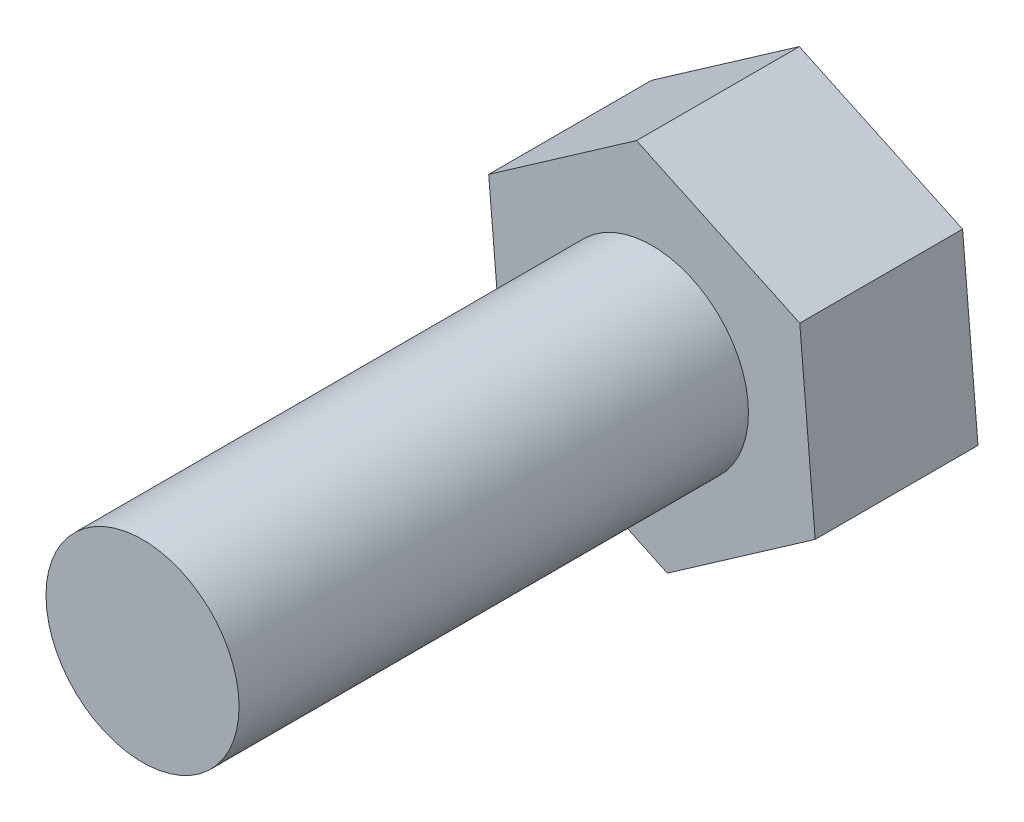
ISO-10303-21;
HEADER;
FILE_DESCRIPTION(('STEP AP214'),'2;1');
FILE_NAME('part.step','',(''),(''),'','','');
FILE_SCHEMA(('AUTOMOTIVE_DESIGN { 1 0 10303 214 1 1 1 1 }'));
ENDSEC;
DATA;
#1=APPLICATION_CONTEXT('core data for automotive mechanical design processes');
#2=APPLICATION_PROTOCOL_DEFINITION('international standard','automotive_design',2000,#1);
#3=PRODUCT_CONTEXT('',#1,'mechanical');
#4=PRODUCT('Part','Part','',(#3));
#5=PRODUCT_RELATED_PRODUCT_CATEGORY('part','',(#4));
#6=PRODUCT_DEFINITION_FORMATION('','',#4);
#7=PRODUCT_DEFINITION_CONTEXT('part definition',#1,'design');
#8=PRODUCT_DEFINITION('design','',#6,#7);
#9=PRODUCT_DEFINITION_SHAPE('','',#8);
#10=(LENGTH_UNIT() NAMED_UNIT(*) SI_UNIT(.MILLI.,.METRE.));
#11=(NAMED_UNIT(*) PLANE_ANGLE_UNIT() SI_UNIT($,.RADIAN.));
#12=(NAMED_UNIT(*) SI_UNIT($,.STERADIAN.) SOLID_ANGLE_UNIT());
#13=UNCERTAINTY_MEASURE_WITH_UNIT(LENGTH_MEASURE(1.E-05),#10,'distance_accuracy_value','');
#14=(GEOMETRIC_REPRESENTATION_CONTEXT(3) GLOBAL_UNCERTAINTY_ASSIGNED_CONTEXT((#13)) GLOBAL_UNIT_ASSIGNED_CONTEXT((#10,
#11,#12)) REPRESENTATION_CONTEXT('',''));
#15=CARTESIAN_POINT('',(0.,0.,0.));
#16=DIRECTION('',(0.,0.,1.));
#17=DIRECTION('',(1.,0.,0.));
#18=AXIS2_PLACEMENT_3D('',#15,#16,#17);
#19=CARTESIAN_POINT('',(-63.1293214477623,-11.1289207444886,0.));
#20=DIRECTION('',(0.,0.,1.));
#21=DIRECTION('',(1.,0.,0.));
#22=AXIS2_PLACEMENT_3D('',#19,#20,#21);
#23=PLANE('',#22);
#24=DIRECTION('',(-0.0855136291043812,0.996337000837266,0.));
#25=VECTOR('',#24,1.);
#26=CARTESIAN_POINT('',(-8.19005950123517,-34.5509822121306,0.));
#27=LINE('',#26,#25);
#28=CARTESIAN_POINT('',(-8.04900697774375,-36.1944143724528,0.));
#29=VERTEX_POINT('',#28);
#30=CARTESIAN_POINT('',(-8.71173760330268,-28.4728026159639,0.));
#31=VERTEX_POINT('',#30);
#32=EDGE_CURVE('E108',#29,#31,#27,.T.);
#33=ORIENTED_EDGE('',*,*,#32,.F.);
#34=DIRECTION('',(0.820096338903279,0.572225475592828,0.));
#35=VECTOR('',#34,1.);
#36=CARTESIAN_POINT('',(-11.226880290994,-38.411788090375,0.));
#37=LINE('',#36,#35);
#38=CARTESIAN_POINT('',(-14.4047536042442,-40.6291618082971,0.));
#39=VERTEX_POINT('',#38);
#40=EDGE_CURVE('E20',#39,#29,#37,.T.);
#41=ORIENTED_EDGE('',*,*,#40,.F.);
#42=DIRECTION('',(0.90560996800766,-0.424111525244439,0.));
#43=VECTOR('',#42,1.);
#44=CARTESIAN_POINT('',(-17.9139922302738,-38.9857296479749,0.));
#45=LINE('',#44,#43);
#46=CARTESIAN_POINT('',(-21.4232308563035,-37.3422974876528,0.));
#47=VERTEX_POINT('',#46);
#48=EDGE_CURVE('E74',#47,#39,#45,.T.);
#49=ORIENTED_EDGE('',*,*,#48,.F.);
#50=DIRECTION('',(0.0855136291043807,-0.996337000837266,0.));
#51=VECTOR('',#50,1.);
#52=CARTESIAN_POINT('',(-21.6135436455915,-35.1249237697305,0.));
#53=LINE('',#52,#51);
#54=CARTESIAN_POINT('',(-22.0859614818625,-29.6206857311639,0.));
#55=VERTEX_POINT('',#54);
#56=EDGE_CURVE('E77',#55,#47,#53,.T.);
#57=ORIENTED_EDGE('',*,*,#56,.F.);
#58=DIRECTION('',(-0.82009633890328,-0.572225475592827,0.));
#59=VECTOR('',#58,1.);
#60=CARTESIAN_POINT('',(-18.9080881686122,-27.4033120132418,0.));
#61=LINE('',#60,#59);
#62=CARTESIAN_POINT('',(-15.7302148553621,-25.1859382953196,0.));
#63=VERTEX_POINT('',#62);
#64=EDGE_CURVE('E133',#63,#55,#61,.T.);
#65=ORIENTED_EDGE('',*,*,#64,.F.);
#66=DIRECTION('',(-0.90560996800766,0.424111525244439,0.));
#67=VECTOR('',#66,1.);
#68=CARTESIAN_POINT('',(-12.2209762293324,-26.8293704556418,0.));
#69=LINE('',#68,#67);
#70=EDGE_CURVE('E118',#31,#63,#69,.T.);
#71=ORIENTED_EDGE('',*,*,#70,.F.);
#72=EDGE_LOOP('',(#33,#41,#49,#57,#65,#71));
#73=FACE_BOUND('',#72,.T.);
#74=ADVANCED_FACE('F17',(#73),#23,.F.);
#75=CARTESIAN_POINT('',(-63.1293214477623,-11.1289207444886,7.));
#76=DIRECTION('',(0.,0.,1.));
#77=DIRECTION('',(1.,0.,0.));
#78=AXIS2_PLACEMENT_3D('',#75,#76,#77);
#79=PLANE('',#78);
#80=CARTESIAN_POINT('',(-15.0674842298031,-32.9075500518083,7.));
#81=DIRECTION('',(0.,0.,1.));
#82=DIRECTION('',(1.,0.,0.));
#83=AXIS2_PLACEMENT_3D('',#80,#81,#82);
#84=CIRCLE('',#83,4.15);
#85=CARTESIAN_POINT('',(-10.9174842298031,-32.9075500518083,7.));
#86=VERTEX_POINT('',#85);
#87=EDGE_CURVE('E159',#86,#86,#84,.T.);
#88=ORIENTED_EDGE('',*,*,#87,.F.);
#89=EDGE_LOOP('',(#88));
#90=FACE_BOUND('',#89,.T.);
#91=DIRECTION('',(-0.0855136291043812,0.996337000837266,0.));
#92=VECTOR('',#91,1.);
#93=CARTESIAN_POINT('',(-8.19005950123517,-34.5509822121306,7.));
#94=LINE('',#93,#92);
#95=CARTESIAN_POINT('',(-8.04900697774375,-36.1944143724528,7.));
#96=VERTEX_POINT('',#95);
#97=CARTESIAN_POINT('',(-8.71173760330268,-28.4728026159639,7.));
#98=VERTEX_POINT('',#97);
#99=EDGE_CURVE('E110',#96,#98,#94,.T.);
#100=ORIENTED_EDGE('',*,*,#99,.T.);
#101=DIRECTION('',(-0.90560996800766,0.424111525244439,0.));
#102=VECTOR('',#101,1.);
#103=CARTESIAN_POINT('',(-12.2209762293324,-26.8293704556418,7.));
#104=LINE('',#103,#102);
#105=CARTESIAN_POINT('',(-15.7302148553621,-25.1859382953196,7.));
#106=VERTEX_POINT('',#105);
#107=EDGE_CURVE('E129',#98,#106,#104,.T.);
#108=ORIENTED_EDGE('',*,*,#107,.T.);
#109=DIRECTION('',(-0.82009633890328,-0.572225475592827,0.));
#110=VECTOR('',#109,1.);
#111=CARTESIAN_POINT('',(-18.9080881686122,-27.4033120132418,7.));
#112=LINE('',#111,#110);
#113=CARTESIAN_POINT('',(-22.0859614818625,-29.6206857311639,7.));
#114=VERTEX_POINT('',#113);
#115=EDGE_CURVE('E98',#106,#114,#112,.T.);
#116=ORIENTED_EDGE('',*,*,#115,.T.);
#117=DIRECTION('',(0.0855136291043807,-0.996337000837266,0.));
#118=VECTOR('',#117,1.);
#119=CARTESIAN_POINT('',(-21.6135436455915,-35.1249237697305,7.));
#120=LINE('',#119,#118);
#121=CARTESIAN_POINT('',(-21.4232308563035,-37.3422974876528,7.));
#122=VERTEX_POINT('',#121);
#123=EDGE_CURVE('E83',#114,#122,#120,.T.);
#124=ORIENTED_EDGE('',*,*,#123,.T.);
#125=DIRECTION('',(0.90560996800766,-0.424111525244439,0.));
#126=VECTOR('',#125,1.);
#127=CARTESIAN_POINT('',(-17.9139922302738,-38.9857296479749,7.));
#128=LINE('',#127,#126);
#129=CARTESIAN_POINT('',(-14.4047536042442,-40.6291618082971,7.));
#130=VERTEX_POINT('',#129);
#131=EDGE_CURVE('E88',#122,#130,#128,.T.);
#132=ORIENTED_EDGE('',*,*,#131,.T.);
#133=DIRECTION('',(0.820096338903279,0.572225475592828,0.));
#134=VECTOR('',#133,1.);
#135=CARTESIAN_POINT('',(-11.226880290994,-38.411788090375,7.));
#136=LINE('',#135,#134);
#137=EDGE_CURVE('E11',#130,#96,#136,.T.);
#138=ORIENTED_EDGE('',*,*,#137,.T.);
#139=EDGE_LOOP('',(#100,#108,#116,#124,#132,#138));
#140=FACE_BOUND('',#139,.T.);
#141=ADVANCED_FACE('F171',(#90,#140),#79,.T.);
#142=CARTESIAN_POINT('',(-11.226880290994,-38.411788090375,7.));
#143=DIRECTION('',(-0.572225475592827,0.82009633890328,0.));
#144=DIRECTION('',(0.,0.,1.));
#145=AXIS2_PLACEMENT_3D('',#142,#143,#144);
#146=PLANE('',#145);
#147=ORIENTED_EDGE('',*,*,#40,.T.);
#148=DIRECTION('',(0.,0.,-1.));
#149=VECTOR('',#148,1.);
#150=CARTESIAN_POINT('',(-8.04900697774375,-36.1944143724528,7.));
#151=LINE('',#150,#149);
#152=EDGE_CURVE('E113',#96,#29,#151,.T.);
#153=ORIENTED_EDGE('',*,*,#152,.F.);
#154=ORIENTED_EDGE('',*,*,#137,.F.);
#155=DIRECTION('',(0.,0.,-1.));
#156=VECTOR('',#155,1.);
#157=CARTESIAN_POINT('',(-14.4047536042442,-40.6291618082971,7.));
#158=LINE('',#157,#156);
#159=EDGE_CURVE('E82',#130,#39,#158,.T.);
#160=ORIENTED_EDGE('',*,*,#159,.T.);
#161=EDGE_LOOP('',(#147,#153,#154,#160));
#162=FACE_BOUND('',#161,.T.);
#163=ADVANCED_FACE('F144',(#162),#146,.F.);
#164=CARTESIAN_POINT('',(-17.9139922302738,-38.9857296479749,7.));
#165=DIRECTION('',(0.424111525244439,0.90560996800766,0.));
#166=DIRECTION('',(0.,0.,-1.));
#167=AXIS2_PLACEMENT_3D('',#164,#165,#166);
#168=PLANE('',#167);
#169=ORIENTED_EDGE('',*,*,#48,.T.);
#170=ORIENTED_EDGE('',*,*,#159,.F.);
#171=ORIENTED_EDGE('',*,*,#131,.F.);
#172=DIRECTION('',(0.,0.,-1.));
#173=VECTOR('',#172,1.);
#174=CARTESIAN_POINT('',(-21.4232308563035,-37.3422974876528,7.));
#175=LINE('',#174,#173);
#176=EDGE_CURVE('E86',#122,#47,#175,.T.);
#177=ORIENTED_EDGE('',*,*,#176,.T.);
#178=EDGE_LOOP('',(#169,#170,#171,#177));
#179=FACE_BOUND('',#178,.T.);
#180=ADVANCED_FACE('F87',(#179),#168,.F.);
#181=CARTESIAN_POINT('',(-21.6135436455915,-35.1249237697305,7.));
#182=DIRECTION('',(0.996337000837266,0.0855136291043807,0.));
#183=DIRECTION('',(0.,0.,-1.));
#184=AXIS2_PLACEMENT_3D('',#181,#182,#183);
#185=PLANE('',#184);
#186=ORIENTED_EDGE('',*,*,#56,.T.);
#187=ORIENTED_EDGE('',*,*,#176,.F.);
#188=ORIENTED_EDGE('',*,*,#123,.F.);
#189=DIRECTION('',(0.,0.,-1.));
#190=VECTOR('',#189,1.);
#191=CARTESIAN_POINT('',(-22.0859614818625,-29.6206857311639,7.));
#192=LINE('',#191,#190);
#193=EDGE_CURVE('E95',#114,#55,#192,.T.);
#194=ORIENTED_EDGE('',*,*,#193,.T.);
#195=EDGE_LOOP('',(#186,#187,#188,#194));
#196=FACE_BOUND('',#195,.T.);
#197=ADVANCED_FACE('F93',(#196),#185,.F.);
#198=CARTESIAN_POINT('',(-18.9080881686122,-27.4033120132418,7.));
#199=DIRECTION('',(0.572225475592827,-0.82009633890328,0.));
#200=DIRECTION('',(0.,0.,-1.));
#201=AXIS2_PLACEMENT_3D('',#198,#199,#200);
#202=PLANE('',#201);
#203=ORIENTED_EDGE('',*,*,#64,.T.);
#204=ORIENTED_EDGE('',*,*,#193,.F.);
#205=ORIENTED_EDGE('',*,*,#115,.F.);
#206=DIRECTION('',(0.,0.,-1.));
#207=VECTOR('',#206,1.);
#208=CARTESIAN_POINT('',(-15.7302148553621,-25.1859382953196,7.));
#209=LINE('',#208,#207);
#210=EDGE_CURVE('E122',#106,#63,#209,.T.);
#211=ORIENTED_EDGE('',*,*,#210,.T.);
#212=EDGE_LOOP('',(#203,#204,#205,#211));
#213=FACE_BOUND('',#212,.T.);
#214=ADVANCED_FACE('F214',(#213),#202,.F.);
#215=CARTESIAN_POINT('',(-12.2209762293324,-26.8293704556418,7.));
#216=DIRECTION('',(-0.424111525244439,-0.90560996800766,0.));
#217=DIRECTION('',(-0.90560996800766,0.424111525244439,0.));
#218=AXIS2_PLACEMENT_3D('',#215,#216,#217);
#219=PLANE('',#218);
#220=ORIENTED_EDGE('',*,*,#70,.T.);
#221=ORIENTED_EDGE('',*,*,#210,.F.);
#222=ORIENTED_EDGE('',*,*,#107,.F.);
#223=DIRECTION('',(0.,0.,-1.));
#224=VECTOR('',#223,1.);
#225=CARTESIAN_POINT('',(-8.71173760330268,-28.4728026159639,7.));
#226=LINE('',#225,#224);
#227=EDGE_CURVE('E114',#98,#31,#226,.T.);
#228=ORIENTED_EDGE('',*,*,#227,.T.);
#229=EDGE_LOOP('',(#220,#221,#222,#228));
#230=FACE_BOUND('',#229,.T.);
#231=ADVANCED_FACE('F178',(#230),#219,.F.);
#232=CARTESIAN_POINT('',(-8.19005950123517,-34.5509822121306,7.));
#233=DIRECTION('',(-0.996337000837266,-0.0855136291043812,0.));
#234=DIRECTION('',(-0.0855136291043812,0.996337000837266,0.));
#235=AXIS2_PLACEMENT_3D('',#232,#233,#234);
#236=PLANE('',#235);
#237=ORIENTED_EDGE('',*,*,#32,.T.);
#238=ORIENTED_EDGE('',*,*,#227,.F.);
#239=ORIENTED_EDGE('',*,*,#99,.F.);
#240=ORIENTED_EDGE('',*,*,#152,.T.);
#241=EDGE_LOOP('',(#237,#238,#239,#240));
#242=FACE_BOUND('',#241,.T.);
#243=ADVANCED_FACE('F152',(#242),#236,.F.);
#244=CARTESIAN_POINT('',(-63.1293214477623,-11.1289207444886,28.9));
#245=DIRECTION('',(0.,0.,1.));
#246=DIRECTION('',(1.,0.,0.));
#247=AXIS2_PLACEMENT_3D('',#244,#245,#246);
#248=PLANE('',#247);
#249=CARTESIAN_POINT('',(-15.0674842298031,-32.9075500518083,28.9));
#250=DIRECTION('',(0.,0.,1.));
#251=DIRECTION('',(1.,0.,0.));
#252=AXIS2_PLACEMENT_3D('',#249,#250,#251);
#253=CIRCLE('',#252,4.15);
#254=CARTESIAN_POINT('',(-10.9174842298031,-32.9075500518083,28.9));
#255=VERTEX_POINT('',#254);
#256=EDGE_CURVE('E155',#255,#255,#253,.T.);
#257=ORIENTED_EDGE('',*,*,#256,.T.);
#258=EDGE_LOOP('',(#257));
#259=FACE_BOUND('',#258,.T.);
#260=ADVANCED_FACE('F235',(#259),#248,.T.);
#261=CARTESIAN_POINT('',(-15.0674842298031,-32.9075500518083,28.9));
#262=DIRECTION('',(0.,0.,-1.));
#263=DIRECTION('',(-1.,0.,0.));
#264=AXIS2_PLACEMENT_3D('',#261,#262,#263);
#265=CYLINDRICAL_SURFACE('',#264,4.15);
#266=ORIENTED_EDGE('',*,*,#256,.F.);
#267=EDGE_LOOP('',(#266));
#268=FACE_BOUND('',#267,.T.);
#269=ORIENTED_EDGE('',*,*,#87,.T.);
#270=EDGE_LOOP('',(#269));
#271=FACE_BOUND('',#270,.T.);
#272=ADVANCED_FACE('F169',(#268,#271),#265,.T.);
#273=CLOSED_SHELL('',(#74,#141,#163,#180,#197,#214,#231,#243,#260,#272));
#274=MANIFOLD_SOLID_BREP('B1',#273);
#275=ADVANCED_BREP_SHAPE_REPRESENTATION('',(#18,#274),#14);
#276=SHAPE_DEFINITION_REPRESENTATION(#9,#275);
ENDSEC;
END-ISO-10303-21;
